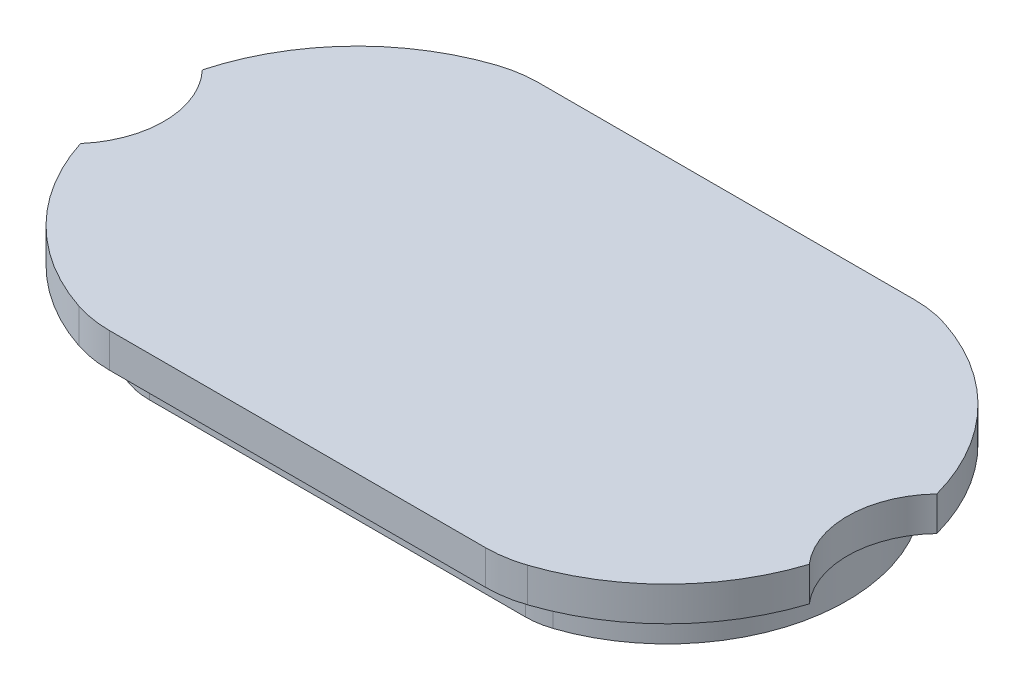
ISO-10303-21;
HEADER;
FILE_DESCRIPTION(('STEP AP214'),'2;1');
FILE_NAME('part.step','',(''),(''),'','','');
FILE_SCHEMA(('AUTOMOTIVE_DESIGN { 1 0 10303 214 1 1 1 1 }'));
ENDSEC;
DATA;
#1=APPLICATION_CONTEXT('core data for automotive mechanical design processes');
#2=APPLICATION_PROTOCOL_DEFINITION('international standard','automotive_design',2000,#1);
#3=PRODUCT_CONTEXT('',#1,'mechanical');
#4=PRODUCT('Part','Part','',(#3));
#5=PRODUCT_RELATED_PRODUCT_CATEGORY('part','',(#4));
#6=PRODUCT_DEFINITION_FORMATION('','',#4);
#7=PRODUCT_DEFINITION_CONTEXT('part definition',#1,'design');
#8=PRODUCT_DEFINITION('design','',#6,#7);
#9=PRODUCT_DEFINITION_SHAPE('','',#8);
#10=(LENGTH_UNIT() NAMED_UNIT(*) SI_UNIT(.MILLI.,.METRE.));
#11=(NAMED_UNIT(*) PLANE_ANGLE_UNIT() SI_UNIT($,.RADIAN.));
#12=(NAMED_UNIT(*) SI_UNIT($,.STERADIAN.) SOLID_ANGLE_UNIT());
#13=UNCERTAINTY_MEASURE_WITH_UNIT(LENGTH_MEASURE(1.E-05),#10,'distance_accuracy_value','');
#14=(GEOMETRIC_REPRESENTATION_CONTEXT(3) GLOBAL_UNCERTAINTY_ASSIGNED_CONTEXT((#13)) GLOBAL_UNIT_ASSIGNED_CONTEXT((#10,
#11,#12)) REPRESENTATION_CONTEXT('',''));
#15=CARTESIAN_POINT('',(0.,0.,0.));
#16=DIRECTION('',(0.,0.,1.));
#17=DIRECTION('',(1.,0.,0.));
#18=AXIS2_PLACEMENT_3D('',#15,#16,#17);
#19=CARTESIAN_POINT('',(-28.0219830583856,6.,-1.10913174767152));
#20=DIRECTION('',(0.,-1.,0.));
#21=DIRECTION('',(0.,0.,-1.));
#22=AXIS2_PLACEMENT_3D('',#19,#20,#21);
#23=CYLINDRICAL_SURFACE('',#22,38.4375);
#24=DIRECTION('',(0.,-1.,0.));
#25=VECTOR('',#24,1.);
#26=CARTESIAN_POINT('',(-65.1201453529565,5.,-11.1673503084143));
#27=LINE('',#26,#25);
#28=CARTESIAN_POINT('',(-65.1201453529565,6.,-11.1673503084143));
#29=VERTEX_POINT('',#28);
#30=CARTESIAN_POINT('',(-65.1201453529565,0.,-11.1673503084143));
#31=VERTEX_POINT('',#30);
#32=EDGE_CURVE('E218',#29,#31,#27,.T.);
#33=ORIENTED_EDGE('',*,*,#32,.F.);
#34=CARTESIAN_POINT('',(-28.0219830583856,6.,-1.10913174767152));
#35=DIRECTION('',(0.,1.,0.));
#36=DIRECTION('',(0.,0.,1.));
#37=AXIS2_PLACEMENT_3D('',#34,#35,#36);
#38=CIRCLE('',#37,38.4375);
#39=CARTESIAN_POINT('',(-40.1227436589354,6.,-37.5921825951292));
#40=VERTEX_POINT('',#39);
#41=EDGE_CURVE('E309',#40,#29,#38,.T.);
#42=ORIENTED_EDGE('',*,*,#41,.F.);
#43=DIRECTION('',(0.,-1.,0.));
#44=VECTOR('',#43,1.);
#45=CARTESIAN_POINT('',(-40.1227436589354,6.,-37.5921825951292));
#46=LINE('',#45,#44);
#47=CARTESIAN_POINT('',(-40.1227436589354,0.,-37.5921825951292));
#48=VERTEX_POINT('',#47);
#49=EDGE_CURVE('E259',#40,#48,#46,.T.);
#50=ORIENTED_EDGE('',*,*,#49,.T.);
#51=CARTESIAN_POINT('',(-28.0219830583856,0.,-1.10913174767152));
#52=DIRECTION('',(0.,1.,0.));
#53=DIRECTION('',(0.,0.,1.));
#54=AXIS2_PLACEMENT_3D('',#51,#52,#53);
#55=CIRCLE('',#54,38.4375);
#56=EDGE_CURVE('E237',#48,#31,#55,.T.);
#57=ORIENTED_EDGE('',*,*,#56,.T.);
#58=EDGE_LOOP('',(#33,#42,#50,#57));
#59=FACE_BOUND('',#58,.T.);
#60=ADVANCED_FACE('F33',(#59),#23,.T.);
#61=DIRECTION('',(0.,-1.,0.));
#62=VECTOR('',#61,1.);
#63=CARTESIAN_POINT('',(-64.6259224052166,5.,10.6208738168417));
#64=LINE('',#63,#62);
#65=CARTESIAN_POINT('',(-64.6259224052166,0.,10.6208738168417));
#66=VERTEX_POINT('',#65);
#67=CARTESIAN_POINT('',(-64.6259224052166,6.,10.6208738168417));
#68=VERTEX_POINT('',#67);
#69=EDGE_CURVE('E48',#66,#68,#64,.F.);
#70=ORIENTED_EDGE('',*,*,#69,.F.);
#71=CARTESIAN_POINT('',(-40.1227436589354,0.,35.3739190997861));
#72=VERTEX_POINT('',#71);
#73=EDGE_CURVE('E228',#66,#72,#55,.T.);
#74=ORIENTED_EDGE('',*,*,#73,.T.);
#75=DIRECTION('',(0.,-1.,0.));
#76=VECTOR('',#75,1.);
#77=CARTESIAN_POINT('',(-40.1227436589354,6.,35.3739190997861));
#78=LINE('',#77,#76);
#79=CARTESIAN_POINT('',(-40.1227436589354,6.,35.3739190997861));
#80=VERTEX_POINT('',#79);
#81=EDGE_CURVE('E257',#72,#80,#78,.F.);
#82=ORIENTED_EDGE('',*,*,#81,.T.);
#83=EDGE_CURVE('E230',#68,#80,#38,.T.);
#84=ORIENTED_EDGE('',*,*,#83,.F.);
#85=EDGE_LOOP('',(#70,#74,#82,#84));
#86=FACE_BOUND('',#85,.T.);
#87=ADVANCED_FACE('F226',(#86),#23,.T.);
#88=CARTESIAN_POINT('',(26.1030169416145,6.,-1.10913174767152));
#89=DIRECTION('',(0.,-1.,0.));
#90=DIRECTION('',(0.,0.,-1.));
#91=AXIS2_PLACEMENT_3D('',#88,#89,#90);
#92=CYLINDRICAL_SURFACE('',#91,38.4375);
#93=DIRECTION('',(0.,-1.,0.));
#94=VECTOR('',#93,1.);
#95=CARTESIAN_POINT('',(62.7069562884455,5.,10.6208738168417));
#96=LINE('',#95,#94);
#97=CARTESIAN_POINT('',(62.7069562884455,6.,10.6208738168417));
#98=VERTEX_POINT('',#97);
#99=CARTESIAN_POINT('',(62.7069562884455,0.,10.6208738168417));
#100=VERTEX_POINT('',#99);
#101=EDGE_CURVE('E506',#98,#100,#96,.T.);
#102=ORIENTED_EDGE('',*,*,#101,.F.);
#103=CARTESIAN_POINT('',(26.1030169416145,6.,-1.10913174767152));
#104=DIRECTION('',(0.,1.,0.));
#105=DIRECTION('',(0.,0.,-1.));
#106=AXIS2_PLACEMENT_3D('',#103,#104,#105);
#107=CIRCLE('',#106,38.4375);
#108=CARTESIAN_POINT('',(38.2037775421643,6.,35.3739190997861));
#109=VERTEX_POINT('',#108);
#110=EDGE_CURVE('E300',#109,#98,#107,.T.);
#111=ORIENTED_EDGE('',*,*,#110,.F.);
#112=DIRECTION('',(0.,-1.,0.));
#113=VECTOR('',#112,1.);
#114=CARTESIAN_POINT('',(38.2037775421643,6.,35.3739190997861));
#115=LINE('',#114,#113);
#116=CARTESIAN_POINT('',(38.2037775421643,0.,35.3739190997861));
#117=VERTEX_POINT('',#116);
#118=EDGE_CURVE('E291',#109,#117,#115,.T.);
#119=ORIENTED_EDGE('',*,*,#118,.T.);
#120=CARTESIAN_POINT('',(26.1030169416145,0.,-1.10913174767152));
#121=DIRECTION('',(0.,1.,0.));
#122=DIRECTION('',(0.,0.,-1.));
#123=AXIS2_PLACEMENT_3D('',#120,#121,#122);
#124=CIRCLE('',#123,38.4375);
#125=EDGE_CURVE('E251',#117,#100,#124,.T.);
#126=ORIENTED_EDGE('',*,*,#125,.T.);
#127=EDGE_LOOP('',(#102,#111,#119,#126));
#128=FACE_BOUND('',#127,.T.);
#129=ADVANCED_FACE('F631',(#128),#92,.T.);
#130=DIRECTION('',(0.,-1.,0.));
#131=VECTOR('',#130,1.);
#132=CARTESIAN_POINT('',(63.2011792361854,5.,-11.1673503084143));
#133=LINE('',#132,#131);
#134=CARTESIAN_POINT('',(63.2011792361854,0.,-11.1673503084143));
#135=VERTEX_POINT('',#134);
#136=CARTESIAN_POINT('',(63.2011792361854,6.,-11.1673503084143));
#137=VERTEX_POINT('',#136);
#138=EDGE_CURVE('E55',#135,#137,#133,.F.);
#139=ORIENTED_EDGE('',*,*,#138,.F.);
#140=CARTESIAN_POINT('',(38.2037775421643,0.,-37.5921825951292));
#141=VERTEX_POINT('',#140);
#142=EDGE_CURVE('E250',#135,#141,#124,.T.);
#143=ORIENTED_EDGE('',*,*,#142,.T.);
#144=DIRECTION('',(0.,-1.,0.));
#145=VECTOR('',#144,1.);
#146=CARTESIAN_POINT('',(38.2037775421643,6.,-37.5921825951292));
#147=LINE('',#146,#145);
#148=CARTESIAN_POINT('',(38.2037775421643,6.,-37.5921825951292));
#149=VERTEX_POINT('',#148);
#150=EDGE_CURVE('E288',#141,#149,#147,.F.);
#151=ORIENTED_EDGE('',*,*,#150,.T.);
#152=EDGE_CURVE('E298',#137,#149,#107,.T.);
#153=ORIENTED_EDGE('',*,*,#152,.F.);
#154=EDGE_LOOP('',(#139,#143,#151,#153));
#155=FACE_BOUND('',#154,.T.);
#156=ADVANCED_FACE('F303',(#155),#92,.T.);
#157=CARTESIAN_POINT('',(-28.0219830583856,0.,-1.10913174767152));
#158=DIRECTION('',(0.,1.,0.));
#159=DIRECTION('',(0.,0.,1.));
#160=AXIS2_PLACEMENT_3D('',#157,#158,#159);
#161=PLANE('',#160);
#162=CARTESIAN_POINT('',(-76.9189661167711,0.,0.));
#163=DIRECTION('',(0.,1.,0.));
#164=DIRECTION('',(0.,0.,-1.));
#165=AXIS2_PLACEMENT_3D('',#162,#163,#164);
#166=CIRCLE('',#165,16.2456727877753);
#167=EDGE_CURVE('E215',#66,#31,#166,.T.);
#168=ORIENTED_EDGE('',*,*,#167,.T.);
#169=ORIENTED_EDGE('',*,*,#56,.F.);
#170=CARTESIAN_POINT('',(-33.8264129399501,0.,-18.6091317476715));
#171=DIRECTION('',(0.,1.,0.));
#172=DIRECTION('',(0.,0.,1.));
#173=AXIS2_PLACEMENT_3D('',#170,#171,#172);
#174=CIRCLE('',#173,20.);
#175=CARTESIAN_POINT('',(-33.8264129399502,0.,-38.6091317476715));
#176=VERTEX_POINT('',#175);
#177=EDGE_CURVE('E268',#48,#176,#174,.F.);
#178=ORIENTED_EDGE('',*,*,#177,.T.);
#179=DIRECTION('',(-1.,0.,0.));
#180=VECTOR('',#179,1.);
#181=CARTESIAN_POINT('',(34.5405169416144,0.,-38.6091317476715));
#182=LINE('',#181,#180);
#183=CARTESIAN_POINT('',(31.907446823179,0.,-38.6091317476715));
#184=VERTEX_POINT('',#183);
#185=EDGE_CURVE('E254',#184,#176,#182,.T.);
#186=ORIENTED_EDGE('',*,*,#185,.F.);
#187=CARTESIAN_POINT('',(31.907446823179,0.,-18.6091317476715));
#188=DIRECTION('',(0.,1.,0.));
#189=DIRECTION('',(0.,0.,1.));
#190=AXIS2_PLACEMENT_3D('',#187,#188,#189);
#191=CIRCLE('',#190,20.);
#192=EDGE_CURVE('E262',#184,#141,#191,.F.);
#193=ORIENTED_EDGE('',*,*,#192,.T.);
#194=ORIENTED_EDGE('',*,*,#142,.F.);
#195=CARTESIAN_POINT('',(75.,0.,0.));
#196=DIRECTION('',(0.,1.,0.));
#197=DIRECTION('',(0.,0.,1.));
#198=AXIS2_PLACEMENT_3D('',#195,#196,#197);
#199=CIRCLE('',#198,16.2456727877753);
#200=EDGE_CURVE('E657',#135,#100,#199,.T.);
#201=ORIENTED_EDGE('',*,*,#200,.T.);
#202=ORIENTED_EDGE('',*,*,#125,.F.);
#203=CARTESIAN_POINT('',(31.907446823179,0.,16.3908682523285));
#204=DIRECTION('',(0.,1.,0.));
#205=DIRECTION('',(0.,0.,1.));
#206=AXIS2_PLACEMENT_3D('',#203,#204,#205);
#207=CIRCLE('',#206,20.);
#208=CARTESIAN_POINT('',(31.907446823179,0.,36.3908682523285));
#209=VERTEX_POINT('',#208);
#210=EDGE_CURVE('E265',#117,#209,#207,.F.);
#211=ORIENTED_EDGE('',*,*,#210,.T.);
#212=DIRECTION('',(1.,0.,0.));
#213=VECTOR('',#212,1.);
#214=CARTESIAN_POINT('',(34.5405169416144,0.,36.3908682523285));
#215=LINE('',#214,#213);
#216=CARTESIAN_POINT('',(-33.8264129399501,0.,36.3908682523285));
#217=VERTEX_POINT('',#216);
#218=EDGE_CURVE('E240',#217,#209,#215,.T.);
#219=ORIENTED_EDGE('',*,*,#218,.F.);
#220=CARTESIAN_POINT('',(-33.8264129399501,0.,16.3908682523285));
#221=DIRECTION('',(0.,1.,0.));
#222=DIRECTION('',(0.,0.,1.));
#223=AXIS2_PLACEMENT_3D('',#220,#221,#222);
#224=CIRCLE('',#223,20.);
#225=EDGE_CURVE('E235',#217,#72,#224,.F.);
#226=ORIENTED_EDGE('',*,*,#225,.T.);
#227=ORIENTED_EDGE('',*,*,#73,.F.);
#228=EDGE_LOOP('',(#168,#169,#178,#186,#193,#194,#201,#202,#211,#219,#226,#227));
#229=FACE_BOUND('',#228,.T.);
#230=CARTESIAN_POINT('',(31.907446823179,0.,-18.6091317476715));
#231=DIRECTION('',(0.,1.,0.));
#232=DIRECTION('',(0.,0.,1.));
#233=AXIS2_PLACEMENT_3D('',#230,#231,#232);
#234=CIRCLE('',#233,13.);
#235=CARTESIAN_POINT('',(36.0000617905195,0.,-30.948114798519));
#236=VERTEX_POINT('',#235);
#237=CARTESIAN_POINT('',(31.9074468231791,0.,-31.6091317476715));
#238=VERTEX_POINT('',#237);
#239=EDGE_CURVE('E396',#236,#238,#234,.T.);
#240=ORIENTED_EDGE('',*,*,#239,.T.);
#241=DIRECTION('',(1.,0.,0.));
#242=VECTOR('',#241,1.);
#243=CARTESIAN_POINT('',(-33.8264129399501,0.,-31.6091317476715));
#244=LINE('',#243,#242);
#245=CARTESIAN_POINT('',(-33.8264129399501,0.,-31.6091317476715));
#246=VERTEX_POINT('',#245);
#247=EDGE_CURVE('E319',#246,#238,#244,.T.);
#248=ORIENTED_EDGE('',*,*,#247,.F.);
#249=CARTESIAN_POINT('',(-33.8264129399501,0.,-18.6091317476715));
#250=DIRECTION('',(0.,1.,0.));
#251=DIRECTION('',(0.,0.,1.));
#252=AXIS2_PLACEMENT_3D('',#249,#250,#251);
#253=CIRCLE('',#252,13.);
#254=CARTESIAN_POINT('',(-37.9190279072906,0.,-30.948114798519));
#255=VERTEX_POINT('',#254);
#256=EDGE_CURVE('E515',#246,#255,#253,.T.);
#257=ORIENTED_EDGE('',*,*,#256,.T.);
#258=CARTESIAN_POINT('',(-28.0219830583856,0.,-1.10913174767152));
#259=DIRECTION('',(0.,1.,0.));
#260=DIRECTION('',(0.,0.,1.));
#261=AXIS2_PLACEMENT_3D('',#258,#259,#260);
#262=CIRCLE('',#261,31.4375);
#263=CARTESIAN_POINT('',(-37.9190279072906,0.,28.7298513031759));
#264=VERTEX_POINT('',#263);
#265=EDGE_CURVE('E533',#255,#264,#262,.T.);
#266=ORIENTED_EDGE('',*,*,#265,.T.);
#267=CARTESIAN_POINT('',(-33.8264129399501,0.,16.3908682523285));
#268=DIRECTION('',(0.,1.,0.));
#269=DIRECTION('',(0.,0.,1.));
#270=AXIS2_PLACEMENT_3D('',#267,#268,#269);
#271=CIRCLE('',#270,13.);
#272=CARTESIAN_POINT('',(-33.8264129399502,0.,29.3908682523285));
#273=VERTEX_POINT('',#272);
#274=EDGE_CURVE('E554',#264,#273,#271,.T.);
#275=ORIENTED_EDGE('',*,*,#274,.T.);
#276=DIRECTION('',(1.,0.,0.));
#277=VECTOR('',#276,1.);
#278=CARTESIAN_POINT('',(-33.8264129399502,0.,29.3908682523285));
#279=LINE('',#278,#277);
#280=CARTESIAN_POINT('',(31.907446823179,0.,29.3908682523285));
#281=VERTEX_POINT('',#280);
#282=EDGE_CURVE('E575',#273,#281,#279,.T.);
#283=ORIENTED_EDGE('',*,*,#282,.T.);
#284=CARTESIAN_POINT('',(31.907446823179,0.,16.3908682523285));
#285=DIRECTION('',(0.,1.,0.));
#286=DIRECTION('',(0.,0.,1.));
#287=AXIS2_PLACEMENT_3D('',#284,#285,#286);
#288=CIRCLE('',#287,13.);
#289=CARTESIAN_POINT('',(36.0000617905195,0.,28.7298513031759));
#290=VERTEX_POINT('',#289);
#291=EDGE_CURVE('E593',#281,#290,#288,.T.);
#292=ORIENTED_EDGE('',*,*,#291,.T.);
#293=CARTESIAN_POINT('',(26.1030169416145,0.,-1.10913174767152));
#294=DIRECTION('',(0.,1.,0.));
#295=DIRECTION('',(0.,0.,1.));
#296=AXIS2_PLACEMENT_3D('',#293,#294,#295);
#297=CIRCLE('',#296,31.4375);
#298=EDGE_CURVE('E475',#290,#236,#297,.T.);
#299=ORIENTED_EDGE('',*,*,#298,.T.);
#300=EDGE_LOOP('',(#240,#248,#257,#266,#275,#283,#292,#299));
#301=FACE_BOUND('',#300,.T.);
#302=ADVANCED_FACE('F232',(#229,#301),#161,.F.);
#303=CARTESIAN_POINT('',(34.5405169416144,6.,36.3908682523285));
#304=DIRECTION('',(0.,0.,-1.));
#305=DIRECTION('',(-1.,0.,0.));
#306=AXIS2_PLACEMENT_3D('',#303,#304,#305);
#307=PLANE('',#306);
#308=DIRECTION('',(1.,0.,0.));
#309=VECTOR('',#308,1.);
#310=CARTESIAN_POINT('',(34.5405169416144,6.,36.3908682523285));
#311=LINE('',#310,#309);
#312=CARTESIAN_POINT('',(-33.8264129399501,6.,36.3908682523285));
#313=VERTEX_POINT('',#312);
#314=CARTESIAN_POINT('',(31.907446823179,6.,36.3908682523285));
#315=VERTEX_POINT('',#314);
#316=EDGE_CURVE('E307',#313,#315,#311,.T.);
#317=ORIENTED_EDGE('',*,*,#316,.F.);
#318=DIRECTION('',(0.,-1.,0.));
#319=VECTOR('',#318,1.);
#320=CARTESIAN_POINT('',(-33.8264129399501,6.,36.3908682523285));
#321=LINE('',#320,#319);
#322=EDGE_CURVE('E285',#313,#217,#321,.T.);
#323=ORIENTED_EDGE('',*,*,#322,.T.);
#324=ORIENTED_EDGE('',*,*,#218,.T.);
#325=DIRECTION('',(0.,-1.,0.));
#326=VECTOR('',#325,1.);
#327=CARTESIAN_POINT('',(31.907446823179,6.,36.3908682523285));
#328=LINE('',#327,#326);
#329=EDGE_CURVE('E283',#209,#315,#328,.F.);
#330=ORIENTED_EDGE('',*,*,#329,.T.);
#331=EDGE_LOOP('',(#317,#323,#324,#330));
#332=FACE_BOUND('',#331,.T.);
#333=ADVANCED_FACE('F634',(#332),#307,.F.);
#334=CARTESIAN_POINT('',(34.5405169416144,6.,-38.6091317476715));
#335=DIRECTION('',(0.,0.,1.));
#336=DIRECTION('',(1.,0.,0.));
#337=AXIS2_PLACEMENT_3D('',#334,#335,#336);
#338=PLANE('',#337);
#339=ORIENTED_EDGE('',*,*,#185,.T.);
#340=DIRECTION('',(0.,-1.,0.));
#341=VECTOR('',#340,1.);
#342=CARTESIAN_POINT('',(-33.8264129399502,6.,-38.6091317476715));
#343=LINE('',#342,#341);
#344=CARTESIAN_POINT('',(-33.8264129399502,6.,-38.6091317476715));
#345=VERTEX_POINT('',#344);
#346=EDGE_CURVE('E273',#176,#345,#343,.F.);
#347=ORIENTED_EDGE('',*,*,#346,.T.);
#348=DIRECTION('',(-1.,0.,0.));
#349=VECTOR('',#348,1.);
#350=CARTESIAN_POINT('',(34.5405169416144,6.,-38.6091317476715));
#351=LINE('',#350,#349);
#352=CARTESIAN_POINT('',(31.907446823179,6.,-38.6091317476715));
#353=VERTEX_POINT('',#352);
#354=EDGE_CURVE('E246',#353,#345,#351,.T.);
#355=ORIENTED_EDGE('',*,*,#354,.F.);
#356=DIRECTION('',(0.,-1.,0.));
#357=VECTOR('',#356,1.);
#358=CARTESIAN_POINT('',(31.907446823179,6.,-38.6091317476715));
#359=LINE('',#358,#357);
#360=EDGE_CURVE('E270',#353,#184,#359,.T.);
#361=ORIENTED_EDGE('',*,*,#360,.T.);
#362=EDGE_LOOP('',(#339,#347,#355,#361));
#363=FACE_BOUND('',#362,.T.);
#364=ADVANCED_FACE('F676',(#363),#338,.F.);
#365=CARTESIAN_POINT('',(-28.0219830583856,6.,-1.10913174767152));
#366=DIRECTION('',(0.,1.,0.));
#367=DIRECTION('',(0.,0.,1.));
#368=AXIS2_PLACEMENT_3D('',#365,#366,#367);
#369=PLANE('',#368);
#370=ORIENTED_EDGE('',*,*,#41,.T.);
#371=CARTESIAN_POINT('',(-76.9189661167711,6.,0.));
#372=DIRECTION('',(0.,1.,0.));
#373=DIRECTION('',(0.,0.,1.));
#374=AXIS2_PLACEMENT_3D('',#371,#372,#373);
#375=CIRCLE('',#374,16.2456727877753);
#376=EDGE_CURVE('E11',#29,#68,#375,.F.);
#377=ORIENTED_EDGE('',*,*,#376,.T.);
#378=ORIENTED_EDGE('',*,*,#83,.T.);
#379=CARTESIAN_POINT('',(-33.8264129399501,6.,16.3908682523285));
#380=DIRECTION('',(0.,1.,0.));
#381=DIRECTION('',(0.,0.,1.));
#382=AXIS2_PLACEMENT_3D('',#379,#380,#381);
#383=CIRCLE('',#382,20.);
#384=EDGE_CURVE('E279',#80,#313,#383,.T.);
#385=ORIENTED_EDGE('',*,*,#384,.T.);
#386=ORIENTED_EDGE('',*,*,#316,.T.);
#387=CARTESIAN_POINT('',(31.907446823179,6.,16.3908682523285));
#388=DIRECTION('',(0.,1.,0.));
#389=DIRECTION('',(0.,0.,1.));
#390=AXIS2_PLACEMENT_3D('',#387,#388,#389);
#391=CIRCLE('',#390,20.);
#392=EDGE_CURVE('E277',#315,#109,#391,.T.);
#393=ORIENTED_EDGE('',*,*,#392,.T.);
#394=ORIENTED_EDGE('',*,*,#110,.T.);
#395=CARTESIAN_POINT('',(75.,6.,0.));
#396=DIRECTION('',(0.,1.,0.));
#397=DIRECTION('',(0.,0.,1.));
#398=AXIS2_PLACEMENT_3D('',#395,#396,#397);
#399=CIRCLE('',#398,16.2456727877753);
#400=EDGE_CURVE('E41',#98,#137,#399,.F.);
#401=ORIENTED_EDGE('',*,*,#400,.T.);
#402=ORIENTED_EDGE('',*,*,#152,.T.);
#403=CARTESIAN_POINT('',(31.907446823179,6.,-18.6091317476715));
#404=DIRECTION('',(0.,1.,0.));
#405=DIRECTION('',(0.,0.,1.));
#406=AXIS2_PLACEMENT_3D('',#403,#404,#405);
#407=CIRCLE('',#406,20.);
#408=EDGE_CURVE('E275',#149,#353,#407,.T.);
#409=ORIENTED_EDGE('',*,*,#408,.T.);
#410=ORIENTED_EDGE('',*,*,#354,.T.);
#411=CARTESIAN_POINT('',(-33.8264129399501,6.,-18.6091317476715));
#412=DIRECTION('',(0.,1.,0.));
#413=DIRECTION('',(0.,0.,1.));
#414=AXIS2_PLACEMENT_3D('',#411,#412,#413);
#415=CIRCLE('',#414,20.);
#416=EDGE_CURVE('E281',#345,#40,#415,.T.);
#417=ORIENTED_EDGE('',*,*,#416,.T.);
#418=EDGE_LOOP('',(#370,#377,#378,#385,#386,#393,#394,#401,#402,#409,#410,#417));
#419=FACE_BOUND('',#418,.T.);
#420=ADVANCED_FACE('F297',(#419),#369,.T.);
#421=CARTESIAN_POINT('',(-33.8264129399501,6.,-18.6091317476715));
#422=DIRECTION('',(0.,-1.,0.));
#423=DIRECTION('',(0.,0.,-1.));
#424=AXIS2_PLACEMENT_3D('',#421,#422,#423);
#425=CYLINDRICAL_SURFACE('',#424,20.);
#426=ORIENTED_EDGE('',*,*,#416,.F.);
#427=ORIENTED_EDGE('',*,*,#346,.F.);
#428=ORIENTED_EDGE('',*,*,#177,.F.);
#429=ORIENTED_EDGE('',*,*,#49,.F.);
#430=EDGE_LOOP('',(#426,#427,#428,#429));
#431=FACE_BOUND('',#430,.T.);
#432=ADVANCED_FACE('F636',(#431),#425,.T.);
#433=CARTESIAN_POINT('',(-33.8264129399501,6.,16.3908682523285));
#434=DIRECTION('',(0.,-1.,0.));
#435=DIRECTION('',(0.,0.,-1.));
#436=AXIS2_PLACEMENT_3D('',#433,#434,#435);
#437=CYLINDRICAL_SURFACE('',#436,20.);
#438=ORIENTED_EDGE('',*,*,#384,.F.);
#439=ORIENTED_EDGE('',*,*,#81,.F.);
#440=ORIENTED_EDGE('',*,*,#225,.F.);
#441=ORIENTED_EDGE('',*,*,#322,.F.);
#442=EDGE_LOOP('',(#438,#439,#440,#441));
#443=FACE_BOUND('',#442,.T.);
#444=ADVANCED_FACE('F639',(#443),#437,.T.);
#445=CARTESIAN_POINT('',(31.907446823179,6.,16.3908682523285));
#446=DIRECTION('',(0.,-1.,0.));
#447=DIRECTION('',(0.,0.,-1.));
#448=AXIS2_PLACEMENT_3D('',#445,#446,#447);
#449=CYLINDRICAL_SURFACE('',#448,20.);
#450=ORIENTED_EDGE('',*,*,#392,.F.);
#451=ORIENTED_EDGE('',*,*,#329,.F.);
#452=ORIENTED_EDGE('',*,*,#210,.F.);
#453=ORIENTED_EDGE('',*,*,#118,.F.);
#454=EDGE_LOOP('',(#450,#451,#452,#453));
#455=FACE_BOUND('',#454,.T.);
#456=ADVANCED_FACE('F642',(#455),#449,.T.);
#457=CARTESIAN_POINT('',(31.907446823179,6.,-18.6091317476715));
#458=DIRECTION('',(0.,-1.,0.));
#459=DIRECTION('',(0.,0.,-1.));
#460=AXIS2_PLACEMENT_3D('',#457,#458,#459);
#461=CYLINDRICAL_SURFACE('',#460,20.);
#462=ORIENTED_EDGE('',*,*,#408,.F.);
#463=ORIENTED_EDGE('',*,*,#150,.F.);
#464=ORIENTED_EDGE('',*,*,#192,.F.);
#465=ORIENTED_EDGE('',*,*,#360,.F.);
#466=EDGE_LOOP('',(#462,#463,#464,#465));
#467=FACE_BOUND('',#466,.T.);
#468=ADVANCED_FACE('F35',(#467),#461,.T.);
#469=CARTESIAN_POINT('',(36.0000617905195,-8.,-30.948114798519));
#470=DIRECTION('',(0.,1.,0.));
#471=DIRECTION('',(0.,0.,1.));
#472=AXIS2_PLACEMENT_3D('',#469,#470,#471);
#473=PLANE('',#472);
#474=DIRECTION('',(0.314816535949266,0.,-0.949152542372881));
#475=VECTOR('',#474,1.);
#476=CARTESIAN_POINT('',(36.0000617905195,-8.,-30.948114798519));
#477=LINE('',#476,#475);
#478=CARTESIAN_POINT('',(35.0556121826717,-8.,-28.1006571714003));
#479=VERTEX_POINT('',#478);
#480=CARTESIAN_POINT('',(36.0000617905195,-8.,-30.948114798519));
#481=VERTEX_POINT('',#480);
#482=EDGE_CURVE('E437',#479,#481,#477,.T.);
#483=ORIENTED_EDGE('',*,*,#482,.F.);
#484=CARTESIAN_POINT('',(31.907446823179,-8.,-18.6091317476715));
#485=DIRECTION('',(0.,1.,0.));
#486=DIRECTION('',(0.,0.,1.));
#487=AXIS2_PLACEMENT_3D('',#484,#485,#486);
#488=CIRCLE('',#487,10.);
#489=CARTESIAN_POINT('',(31.907446823179,-8.,-28.6091317476715));
#490=VERTEX_POINT('',#489);
#491=EDGE_CURVE('E242',#479,#490,#488,.T.);
#492=ORIENTED_EDGE('',*,*,#491,.T.);
#493=CARTESIAN_POINT('',(31.9074468231791,-8.,-28.6091317476715));
#494=DIRECTION('',(0.,0.,-1.));
#495=VECTOR('',#494,1.);
#496=LINE('',#493,#495);
#497=CARTESIAN_POINT('',(31.9074468231791,-8.,-31.6091317476715));
#498=VERTEX_POINT('',#497);
#499=EDGE_CURVE('E370',#490,#498,#496,.T.);
#500=ORIENTED_EDGE('',*,*,#499,.T.);
#501=CARTESIAN_POINT('',(31.907446823179,-8.,-18.6091317476715));
#502=DIRECTION('',(0.,1.,0.));
#503=DIRECTION('',(0.,0.,1.));
#504=AXIS2_PLACEMENT_3D('',#501,#502,#503);
#505=CIRCLE('',#504,13.);
#506=EDGE_CURVE('E238',#481,#498,#505,.T.);
#507=ORIENTED_EDGE('',*,*,#506,.F.);
#508=EDGE_LOOP('',(#483,#492,#500,#507));
#509=FACE_BOUND('',#508,.T.);
#510=ADVANCED_FACE('F413',(#509),#473,.F.);
#511=CARTESIAN_POINT('',(31.907446823179,0.,-18.6091317476715));
#512=DIRECTION('',(0.,1.,0.));
#513=DIRECTION('',(0.,0.,1.));
#514=AXIS2_PLACEMENT_3D('',#511,#512,#513);
#515=CYLINDRICAL_SURFACE('',#514,10.);
#516=DIRECTION('',(0.,-1.,0.));
#517=VECTOR('',#516,1.);
#518=CARTESIAN_POINT('',(35.0556121826717,0.,-28.1006571714003));
#519=LINE('',#518,#517);
#520=CARTESIAN_POINT('',(35.0556121826717,0.,-28.1006571714003));
#521=VERTEX_POINT('',#520);
#522=EDGE_CURVE('E439',#521,#479,#519,.T.);
#523=ORIENTED_EDGE('',*,*,#522,.F.);
#524=CARTESIAN_POINT('',(31.907446823179,0.,-18.6091317476715));
#525=DIRECTION('',(0.,1.,0.));
#526=DIRECTION('',(0.,0.,1.));
#527=AXIS2_PLACEMENT_3D('',#524,#525,#526);
#528=CIRCLE('',#527,10.);
#529=CARTESIAN_POINT('',(31.907446823179,0.,-28.6091317476715));
#530=VERTEX_POINT('',#529);
#531=EDGE_CURVE('E394',#521,#530,#528,.T.);
#532=ORIENTED_EDGE('',*,*,#531,.T.);
#533=CARTESIAN_POINT('',(31.907446823179,0.,-28.6091317476715));
#534=DIRECTION('',(0.,-1.,0.));
#535=VECTOR('',#534,1.);
#536=LINE('',#533,#535);
#537=EDGE_CURVE('E441',#530,#490,#536,.T.);
#538=ORIENTED_EDGE('',*,*,#537,.T.);
#539=ORIENTED_EDGE('',*,*,#491,.F.);
#540=EDGE_LOOP('',(#523,#532,#538,#539));
#541=FACE_BOUND('',#540,.T.);
#542=ADVANCED_FACE('F402',(#541),#515,.F.);
#543=CARTESIAN_POINT('',(31.907446823179,0.,-18.6091317476715));
#544=DIRECTION('',(0.,1.,0.));
#545=DIRECTION('',(0.,0.,1.));
#546=AXIS2_PLACEMENT_3D('',#543,#544,#545);
#547=CYLINDRICAL_SURFACE('',#546,13.);
#548=DIRECTION('',(0.,1.,0.));
#549=VECTOR('',#548,1.);
#550=CARTESIAN_POINT('',(36.0000617905195,0.,-30.948114798519));
#551=LINE('',#550,#549);
#552=EDGE_CURVE('E477',#481,#236,#551,.T.);
#553=ORIENTED_EDGE('',*,*,#552,.F.);
#554=ORIENTED_EDGE('',*,*,#506,.T.);
#555=CARTESIAN_POINT('',(31.9074468231791,-8.,-31.6091317476715));
#556=DIRECTION('',(0.,1.,0.));
#557=VECTOR('',#556,1.);
#558=LINE('',#555,#557);
#559=EDGE_CURVE('E444',#498,#238,#558,.T.);
#560=ORIENTED_EDGE('',*,*,#559,.T.);
#561=ORIENTED_EDGE('',*,*,#239,.F.);
#562=EDGE_LOOP('',(#553,#554,#560,#561));
#563=FACE_BOUND('',#562,.T.);
#564=ADVANCED_FACE('F412',(#563),#547,.T.);
#565=CARTESIAN_POINT('',(36.0000617905195,-8.,28.7298513031759));
#566=DIRECTION('',(0.,1.,0.));
#567=DIRECTION('',(0.,0.,1.));
#568=AXIS2_PLACEMENT_3D('',#565,#566,#567);
#569=PLANE('',#568);
#570=DIRECTION('',(0.314816535949265,0.,0.949152542372882));
#571=VECTOR('',#570,1.);
#572=CARTESIAN_POINT('',(36.0000617905195,-8.,28.7298513031759));
#573=LINE('',#572,#571);
#574=CARTESIAN_POINT('',(35.0556121826717,-8.,25.8823936760573));
#575=VERTEX_POINT('',#574);
#576=CARTESIAN_POINT('',(36.0000617905195,-8.,28.7298513031759));
#577=VERTEX_POINT('',#576);
#578=EDGE_CURVE('E590',#575,#577,#573,.T.);
#579=ORIENTED_EDGE('',*,*,#578,.F.);
#580=CARTESIAN_POINT('',(26.1030169416145,-8.,-1.10913174767152));
#581=DIRECTION('',(0.,1.,0.));
#582=DIRECTION('',(0.,0.,1.));
#583=AXIS2_PLACEMENT_3D('',#580,#581,#582);
#584=CIRCLE('',#583,28.4375);
#585=EDGE_CURVE('E449',#575,#479,#584,.T.);
#586=ORIENTED_EDGE('',*,*,#585,.T.);
#587=ORIENTED_EDGE('',*,*,#482,.T.);
#588=CARTESIAN_POINT('',(26.1030169416145,-8.,-1.10913174767152));
#589=DIRECTION('',(0.,1.,0.));
#590=DIRECTION('',(0.,0.,1.));
#591=AXIS2_PLACEMENT_3D('',#588,#589,#590);
#592=CIRCLE('',#591,31.4375);
#593=EDGE_CURVE('E445',#577,#481,#592,.T.);
#594=ORIENTED_EDGE('',*,*,#593,.F.);
#595=EDGE_LOOP('',(#579,#586,#587,#594));
#596=FACE_BOUND('',#595,.T.);
#597=ADVANCED_FACE('F739',(#596),#569,.F.);
#598=CARTESIAN_POINT('',(26.1030169416145,0.,-1.10913174767152));
#599=DIRECTION('',(0.,1.,0.));
#600=DIRECTION('',(0.,0.,1.));
#601=AXIS2_PLACEMENT_3D('',#598,#599,#600);
#602=CYLINDRICAL_SURFACE('',#601,28.4375);
#603=DIRECTION('',(0.,-1.,0.));
#604=VECTOR('',#603,1.);
#605=CARTESIAN_POINT('',(35.0556121826717,0.,25.8823936760573));
#606=LINE('',#605,#604);
#607=CARTESIAN_POINT('',(35.0556121826717,0.,25.8823936760573));
#608=VERTEX_POINT('',#607);
#609=EDGE_CURVE('E493',#608,#575,#606,.T.);
#610=ORIENTED_EDGE('',*,*,#609,.F.);
#611=CARTESIAN_POINT('',(26.1030169416145,0.,-1.10913174767152));
#612=DIRECTION('',(0.,1.,0.));
#613=DIRECTION('',(0.,0.,1.));
#614=AXIS2_PLACEMENT_3D('',#611,#612,#613);
#615=CIRCLE('',#614,28.4375);
#616=EDGE_CURVE('E455',#608,#521,#615,.T.);
#617=ORIENTED_EDGE('',*,*,#616,.T.);
#618=ORIENTED_EDGE('',*,*,#522,.T.);
#619=ORIENTED_EDGE('',*,*,#585,.F.);
#620=EDGE_LOOP('',(#610,#617,#618,#619));
#621=FACE_BOUND('',#620,.T.);
#622=ADVANCED_FACE('F491',(#621),#602,.F.);
#623=CARTESIAN_POINT('',(26.1030169416145,0.,-1.10913174767152));
#624=DIRECTION('',(0.,1.,0.));
#625=DIRECTION('',(0.,0.,1.));
#626=AXIS2_PLACEMENT_3D('',#623,#624,#625);
#627=CYLINDRICAL_SURFACE('',#626,31.4375);
#628=DIRECTION('',(0.,1.,0.));
#629=VECTOR('',#628,1.);
#630=CARTESIAN_POINT('',(36.0000617905195,0.,28.7298513031759));
#631=LINE('',#630,#629);
#632=EDGE_CURVE('E587',#577,#290,#631,.T.);
#633=ORIENTED_EDGE('',*,*,#632,.F.);
#634=ORIENTED_EDGE('',*,*,#593,.T.);
#635=ORIENTED_EDGE('',*,*,#552,.T.);
#636=ORIENTED_EDGE('',*,*,#298,.F.);
#637=EDGE_LOOP('',(#633,#634,#635,#636));
#638=FACE_BOUND('',#637,.T.);
#639=ADVANCED_FACE('F478',(#638),#627,.T.);
#640=CARTESIAN_POINT('',(31.907446823179,-8.,29.3908682523285));
#641=DIRECTION('',(0.,1.,0.));
#642=DIRECTION('',(0.,0.,1.));
#643=AXIS2_PLACEMENT_3D('',#640,#641,#642);
#644=PLANE('',#643);
#645=DIRECTION('',(0.,0.,1.));
#646=VECTOR('',#645,1.);
#647=CARTESIAN_POINT('',(31.907446823179,-8.,29.3908682523285));
#648=LINE('',#647,#646);
#649=CARTESIAN_POINT('',(31.907446823179,-8.,26.3908682523285));
#650=VERTEX_POINT('',#649);
#651=CARTESIAN_POINT('',(31.907446823179,-8.,29.3908682523285));
#652=VERTEX_POINT('',#651);
#653=EDGE_CURVE('E572',#650,#652,#648,.T.);
#654=ORIENTED_EDGE('',*,*,#653,.F.);
#655=CARTESIAN_POINT('',(31.907446823179,-8.,16.3908682523285));
#656=DIRECTION('',(0.,1.,0.));
#657=DIRECTION('',(0.,0.,1.));
#658=AXIS2_PLACEMENT_3D('',#655,#656,#657);
#659=CIRCLE('',#658,10.);
#660=EDGE_CURVE('E484',#650,#575,#659,.T.);
#661=ORIENTED_EDGE('',*,*,#660,.T.);
#662=ORIENTED_EDGE('',*,*,#578,.T.);
#663=CARTESIAN_POINT('',(31.907446823179,-8.,16.3908682523285));
#664=DIRECTION('',(0.,1.,0.));
#665=DIRECTION('',(0.,0.,1.));
#666=AXIS2_PLACEMENT_3D('',#663,#664,#665);
#667=CIRCLE('',#666,13.);
#668=EDGE_CURVE('E480',#652,#577,#667,.T.);
#669=ORIENTED_EDGE('',*,*,#668,.F.);
#670=EDGE_LOOP('',(#654,#661,#662,#669));
#671=FACE_BOUND('',#670,.T.);
#672=ADVANCED_FACE('F599',(#671),#644,.F.);
#673=CARTESIAN_POINT('',(31.907446823179,0.,16.3908682523285));
#674=DIRECTION('',(0.,1.,0.));
#675=DIRECTION('',(0.,0.,1.));
#676=AXIS2_PLACEMENT_3D('',#673,#674,#675);
#677=CYLINDRICAL_SURFACE('',#676,10.);
#678=DIRECTION('',(0.,-1.,0.));
#679=VECTOR('',#678,1.);
#680=CARTESIAN_POINT('',(31.907446823179,0.,26.3908682523285));
#681=LINE('',#680,#679);
#682=CARTESIAN_POINT('',(31.907446823179,0.,26.3908682523285));
#683=VERTEX_POINT('',#682);
#684=EDGE_CURVE('E569',#683,#650,#681,.T.);
#685=ORIENTED_EDGE('',*,*,#684,.F.);
#686=CARTESIAN_POINT('',(31.907446823179,0.,16.3908682523285));
#687=DIRECTION('',(0.,1.,0.));
#688=DIRECTION('',(0.,0.,1.));
#689=AXIS2_PLACEMENT_3D('',#686,#687,#688);
#690=CIRCLE('',#689,10.);
#691=EDGE_CURVE('E595',#683,#608,#690,.T.);
#692=ORIENTED_EDGE('',*,*,#691,.T.);
#693=ORIENTED_EDGE('',*,*,#609,.T.);
#694=ORIENTED_EDGE('',*,*,#660,.F.);
#695=EDGE_LOOP('',(#685,#692,#693,#694));
#696=FACE_BOUND('',#695,.T.);
#697=ADVANCED_FACE('F602',(#696),#677,.F.);
#698=CARTESIAN_POINT('',(31.907446823179,0.,16.3908682523285));
#699=DIRECTION('',(0.,1.,0.));
#700=DIRECTION('',(0.,0.,1.));
#701=AXIS2_PLACEMENT_3D('',#698,#699,#700);
#702=CYLINDRICAL_SURFACE('',#701,13.);
#703=DIRECTION('',(0.,1.,0.));
#704=VECTOR('',#703,1.);
#705=CARTESIAN_POINT('',(31.907446823179,0.,29.3908682523285));
#706=LINE('',#705,#704);
#707=EDGE_CURVE('E566',#652,#281,#706,.T.);
#708=ORIENTED_EDGE('',*,*,#707,.F.);
#709=ORIENTED_EDGE('',*,*,#668,.T.);
#710=ORIENTED_EDGE('',*,*,#632,.T.);
#711=ORIENTED_EDGE('',*,*,#291,.F.);
#712=EDGE_LOOP('',(#708,#709,#710,#711));
#713=FACE_BOUND('',#712,.T.);
#714=ADVANCED_FACE('F779',(#713),#702,.T.);
#715=CARTESIAN_POINT('',(-33.8264129399502,-8.,29.3908682523285));
#716=DIRECTION('',(0.,1.,0.));
#717=DIRECTION('',(0.,0.,1.));
#718=AXIS2_PLACEMENT_3D('',#715,#716,#717);
#719=PLANE('',#718);
#720=DIRECTION('',(0.,0.,1.));
#721=VECTOR('',#720,1.);
#722=CARTESIAN_POINT('',(-33.8264129399502,-8.,29.3908682523285));
#723=LINE('',#722,#721);
#724=CARTESIAN_POINT('',(-33.8264129399501,-8.,26.3908682523285));
#725=VERTEX_POINT('',#724);
#726=CARTESIAN_POINT('',(-33.8264129399502,-8.,29.3908682523285));
#727=VERTEX_POINT('',#726);
#728=EDGE_CURVE('E551',#725,#727,#723,.T.);
#729=ORIENTED_EDGE('',*,*,#728,.F.);
#730=DIRECTION('',(1.,0.,0.));
#731=VECTOR('',#730,1.);
#732=CARTESIAN_POINT('',(-33.8264129399501,-8.,26.3908682523285));
#733=LINE('',#732,#731);
#734=EDGE_CURVE('E581',#725,#650,#733,.T.);
#735=ORIENTED_EDGE('',*,*,#734,.T.);
#736=ORIENTED_EDGE('',*,*,#653,.T.);
#737=DIRECTION('',(1.,0.,0.));
#738=VECTOR('',#737,1.);
#739=CARTESIAN_POINT('',(-33.8264129399502,-8.,29.3908682523285));
#740=LINE('',#739,#738);
#741=EDGE_CURVE('E584',#727,#652,#740,.T.);
#742=ORIENTED_EDGE('',*,*,#741,.F.);
#743=EDGE_LOOP('',(#729,#735,#736,#742));
#744=FACE_BOUND('',#743,.T.);
#745=ADVANCED_FACE('F788',(#744),#719,.F.);
#746=CARTESIAN_POINT('',(-33.8264129399501,0.,26.3908682523285));
#747=DIRECTION('',(0.,0.,1.));
#748=DIRECTION('',(1.,0.,0.));
#749=AXIS2_PLACEMENT_3D('',#746,#747,#748);
#750=PLANE('',#749);
#751=DIRECTION('',(0.,-1.,0.));
#752=VECTOR('',#751,1.);
#753=CARTESIAN_POINT('',(-33.8264129399501,0.,26.3908682523285));
#754=LINE('',#753,#752);
#755=CARTESIAN_POINT('',(-33.8264129399501,0.,26.3908682523285));
#756=VERTEX_POINT('',#755);
#757=EDGE_CURVE('E548',#756,#725,#754,.T.);
#758=ORIENTED_EDGE('',*,*,#757,.F.);
#759=DIRECTION('',(1.,0.,0.));
#760=VECTOR('',#759,1.);
#761=CARTESIAN_POINT('',(-33.8264129399501,0.,26.3908682523285));
#762=LINE('',#761,#760);
#763=EDGE_CURVE('E578',#756,#683,#762,.T.);
#764=ORIENTED_EDGE('',*,*,#763,.T.);
#765=ORIENTED_EDGE('',*,*,#684,.T.);
#766=ORIENTED_EDGE('',*,*,#734,.F.);
#767=EDGE_LOOP('',(#758,#764,#765,#766));
#768=FACE_BOUND('',#767,.T.);
#769=ADVANCED_FACE('F606',(#768),#750,.F.);
#770=CARTESIAN_POINT('',(-33.8264129399502,0.,29.3908682523285));
#771=DIRECTION('',(0.,0.,-1.));
#772=DIRECTION('',(-1.,0.,0.));
#773=AXIS2_PLACEMENT_3D('',#770,#771,#772);
#774=PLANE('',#773);
#775=DIRECTION('',(0.,1.,0.));
#776=VECTOR('',#775,1.);
#777=CARTESIAN_POINT('',(-33.8264129399502,0.,29.3908682523285));
#778=LINE('',#777,#776);
#779=EDGE_CURVE('E545',#727,#273,#778,.T.);
#780=ORIENTED_EDGE('',*,*,#779,.F.);
#781=ORIENTED_EDGE('',*,*,#741,.T.);
#782=ORIENTED_EDGE('',*,*,#707,.T.);
#783=ORIENTED_EDGE('',*,*,#282,.F.);
#784=EDGE_LOOP('',(#780,#781,#782,#783));
#785=FACE_BOUND('',#784,.T.);
#786=ADVANCED_FACE('F807',(#785),#774,.F.);
#787=CARTESIAN_POINT('',(-37.9190279072906,-8.,28.7298513031759));
#788=DIRECTION('',(0.,1.,0.));
#789=DIRECTION('',(0.,0.,1.));
#790=AXIS2_PLACEMENT_3D('',#787,#788,#789);
#791=PLANE('',#790);
#792=DIRECTION('',(-0.314816535949265,0.,0.949152542372882));
#793=VECTOR('',#792,1.);
#794=CARTESIAN_POINT('',(-37.9190279072906,-8.,28.7298513031759));
#795=LINE('',#794,#793);
#796=CARTESIAN_POINT('',(-36.9745782994428,-8.,25.8823936760573));
#797=VERTEX_POINT('',#796);
#798=CARTESIAN_POINT('',(-37.9190279072906,-8.,28.7298513031759));
#799=VERTEX_POINT('',#798);
#800=EDGE_CURVE('E530',#797,#799,#795,.T.);
#801=ORIENTED_EDGE('',*,*,#800,.F.);
#802=CARTESIAN_POINT('',(-33.8264129399501,-8.,16.3908682523285));
#803=DIRECTION('',(0.,1.,0.));
#804=DIRECTION('',(0.,0.,1.));
#805=AXIS2_PLACEMENT_3D('',#802,#803,#804);
#806=CIRCLE('',#805,10.);
#807=EDGE_CURVE('E560',#797,#725,#806,.T.);
#808=ORIENTED_EDGE('',*,*,#807,.T.);
#809=ORIENTED_EDGE('',*,*,#728,.T.);
#810=CARTESIAN_POINT('',(-33.8264129399501,-8.,16.3908682523285));
#811=DIRECTION('',(0.,1.,0.));
#812=DIRECTION('',(0.,0.,1.));
#813=AXIS2_PLACEMENT_3D('',#810,#811,#812);
#814=CIRCLE('',#813,13.);
#815=EDGE_CURVE('E563',#799,#727,#814,.T.);
#816=ORIENTED_EDGE('',*,*,#815,.F.);
#817=EDGE_LOOP('',(#801,#808,#809,#816));
#818=FACE_BOUND('',#817,.T.);
#819=ADVANCED_FACE('F816',(#818),#791,.F.);
#820=CARTESIAN_POINT('',(-33.8264129399501,0.,16.3908682523285));
#821=DIRECTION('',(0.,1.,0.));
#822=DIRECTION('',(0.,0.,1.));
#823=AXIS2_PLACEMENT_3D('',#820,#821,#822);
#824=CYLINDRICAL_SURFACE('',#823,10.);
#825=DIRECTION('',(0.,-1.,0.));
#826=VECTOR('',#825,1.);
#827=CARTESIAN_POINT('',(-36.9745782994428,0.,25.8823936760573));
#828=LINE('',#827,#826);
#829=CARTESIAN_POINT('',(-36.9745782994428,0.,25.8823936760573));
#830=VERTEX_POINT('',#829);
#831=EDGE_CURVE('E527',#830,#797,#828,.T.);
#832=ORIENTED_EDGE('',*,*,#831,.F.);
#833=CARTESIAN_POINT('',(-33.8264129399501,0.,16.3908682523285));
#834=DIRECTION('',(0.,1.,0.));
#835=DIRECTION('',(0.,0.,1.));
#836=AXIS2_PLACEMENT_3D('',#833,#834,#835);
#837=CIRCLE('',#836,10.);
#838=EDGE_CURVE('E557',#830,#756,#837,.T.);
#839=ORIENTED_EDGE('',*,*,#838,.T.);
#840=ORIENTED_EDGE('',*,*,#757,.T.);
#841=ORIENTED_EDGE('',*,*,#807,.F.);
#842=EDGE_LOOP('',(#832,#839,#840,#841));
#843=FACE_BOUND('',#842,.T.);
#844=ADVANCED_FACE('F609',(#843),#824,.F.);
#845=CARTESIAN_POINT('',(-33.8264129399501,0.,16.3908682523285));
#846=DIRECTION('',(0.,1.,0.));
#847=DIRECTION('',(0.,0.,1.));
#848=AXIS2_PLACEMENT_3D('',#845,#846,#847);
#849=CYLINDRICAL_SURFACE('',#848,13.);
#850=DIRECTION('',(0.,1.,0.));
#851=VECTOR('',#850,1.);
#852=CARTESIAN_POINT('',(-37.9190279072906,0.,28.7298513031759));
#853=LINE('',#852,#851);
#854=EDGE_CURVE('E524',#799,#264,#853,.T.);
#855=ORIENTED_EDGE('',*,*,#854,.F.);
#856=ORIENTED_EDGE('',*,*,#815,.T.);
#857=ORIENTED_EDGE('',*,*,#779,.T.);
#858=ORIENTED_EDGE('',*,*,#274,.F.);
#859=EDGE_LOOP('',(#855,#856,#857,#858));
#860=FACE_BOUND('',#859,.T.);
#861=ADVANCED_FACE('F835',(#860),#849,.T.);
#862=CARTESIAN_POINT('',(-37.9190279072906,-8.,-30.948114798519));
#863=DIRECTION('',(0.,1.,0.));
#864=DIRECTION('',(0.,0.,1.));
#865=AXIS2_PLACEMENT_3D('',#862,#863,#864);
#866=PLANE('',#865);
#867=DIRECTION('',(-0.314816535949266,0.,-0.949152542372882));
#868=VECTOR('',#867,1.);
#869=CARTESIAN_POINT('',(-37.9190279072906,-8.,-30.948114798519));
#870=LINE('',#869,#868);
#871=CARTESIAN_POINT('',(-36.9745782994428,-8.,-28.1006571714003));
#872=VERTEX_POINT('',#871);
#873=CARTESIAN_POINT('',(-37.9190279072906,-8.,-30.948114798519));
#874=VERTEX_POINT('',#873);
#875=EDGE_CURVE('E512',#872,#874,#870,.T.);
#876=ORIENTED_EDGE('',*,*,#875,.F.);
#877=CARTESIAN_POINT('',(-28.0219830583856,-8.,-1.10913174767152));
#878=DIRECTION('',(0.,1.,0.));
#879=DIRECTION('',(0.,0.,1.));
#880=AXIS2_PLACEMENT_3D('',#877,#878,#879);
#881=CIRCLE('',#880,28.4375);
#882=EDGE_CURVE('E539',#872,#797,#881,.T.);
#883=ORIENTED_EDGE('',*,*,#882,.T.);
#884=ORIENTED_EDGE('',*,*,#800,.T.);
#885=CARTESIAN_POINT('',(-28.0219830583856,-8.,-1.10913174767152));
#886=DIRECTION('',(0.,1.,0.));
#887=DIRECTION('',(0.,0.,1.));
#888=AXIS2_PLACEMENT_3D('',#885,#886,#887);
#889=CIRCLE('',#888,31.4375);
#890=EDGE_CURVE('E542',#874,#799,#889,.T.);
#891=ORIENTED_EDGE('',*,*,#890,.F.);
#892=EDGE_LOOP('',(#876,#883,#884,#891));
#893=FACE_BOUND('',#892,.T.);
#894=ADVANCED_FACE('F844',(#893),#866,.F.);
#895=CARTESIAN_POINT('',(-28.0219830583856,0.,-1.10913174767152));
#896=DIRECTION('',(0.,1.,0.));
#897=DIRECTION('',(0.,0.,1.));
#898=AXIS2_PLACEMENT_3D('',#895,#896,#897);
#899=CYLINDRICAL_SURFACE('',#898,28.4375);
#900=DIRECTION('',(0.,-1.,0.));
#901=VECTOR('',#900,1.);
#902=CARTESIAN_POINT('',(-36.9745782994428,0.,-28.1006571714003));
#903=LINE('',#902,#901);
#904=CARTESIAN_POINT('',(-36.9745782994428,0.,-28.1006571714003));
#905=VERTEX_POINT('',#904);
#906=EDGE_CURVE('E388',#905,#872,#903,.T.);
#907=ORIENTED_EDGE('',*,*,#906,.F.);
#908=CARTESIAN_POINT('',(-28.0219830583856,0.,-1.10913174767152));
#909=DIRECTION('',(0.,1.,0.));
#910=DIRECTION('',(0.,0.,1.));
#911=AXIS2_PLACEMENT_3D('',#908,#909,#910);
#912=CIRCLE('',#911,28.4375);
#913=EDGE_CURVE('E536',#905,#830,#912,.T.);
#914=ORIENTED_EDGE('',*,*,#913,.T.);
#915=ORIENTED_EDGE('',*,*,#831,.T.);
#916=ORIENTED_EDGE('',*,*,#882,.F.);
#917=EDGE_LOOP('',(#907,#914,#915,#916));
#918=FACE_BOUND('',#917,.T.);
#919=ADVANCED_FACE('F612',(#918),#899,.F.);
#920=CARTESIAN_POINT('',(-28.0219830583856,0.,-1.10913174767152));
#921=DIRECTION('',(0.,1.,0.));
#922=DIRECTION('',(0.,0.,1.));
#923=AXIS2_PLACEMENT_3D('',#920,#921,#922);
#924=CYLINDRICAL_SURFACE('',#923,31.4375);
#925=DIRECTION('',(0.,1.,0.));
#926=VECTOR('',#925,1.);
#927=CARTESIAN_POINT('',(-37.9190279072906,0.,-30.948114798519));
#928=LINE('',#927,#926);
#929=EDGE_CURVE('E383',#874,#255,#928,.T.);
#930=ORIENTED_EDGE('',*,*,#929,.F.);
#931=ORIENTED_EDGE('',*,*,#890,.T.);
#932=ORIENTED_EDGE('',*,*,#854,.T.);
#933=ORIENTED_EDGE('',*,*,#265,.F.);
#934=EDGE_LOOP('',(#930,#931,#932,#933));
#935=FACE_BOUND('',#934,.T.);
#936=ADVANCED_FACE('F622',(#935),#924,.T.);
#937=CARTESIAN_POINT('',(-33.8264129399501,-8.,-31.6091317476715));
#938=DIRECTION('',(0.,1.,0.));
#939=DIRECTION('',(0.,0.,1.));
#940=AXIS2_PLACEMENT_3D('',#937,#938,#939);
#941=PLANE('',#940);
#942=DIRECTION('',(0.,0.,-1.));
#943=VECTOR('',#942,1.);
#944=CARTESIAN_POINT('',(-33.8264129399501,-8.,-31.6091317476715));
#945=LINE('',#944,#943);
#946=CARTESIAN_POINT('',(-33.8264129399501,-8.,-28.6091317476715));
#947=VERTEX_POINT('',#946);
#948=CARTESIAN_POINT('',(-33.8264129399501,-8.,-31.6091317476715));
#949=VERTEX_POINT('',#948);
#950=EDGE_CURVE('E361',#947,#949,#945,.T.);
#951=ORIENTED_EDGE('',*,*,#950,.F.);
#952=CARTESIAN_POINT('',(-33.8264129399501,-8.,-18.6091317476715));
#953=DIRECTION('',(0.,1.,0.));
#954=DIRECTION('',(0.,0.,1.));
#955=AXIS2_PLACEMENT_3D('',#952,#953,#954);
#956=CIRCLE('',#955,10.);
#957=EDGE_CURVE('E518',#947,#872,#956,.T.);
#958=ORIENTED_EDGE('',*,*,#957,.T.);
#959=ORIENTED_EDGE('',*,*,#875,.T.);
#960=CARTESIAN_POINT('',(-33.8264129399501,-8.,-18.6091317476715));
#961=DIRECTION('',(0.,1.,0.));
#962=DIRECTION('',(0.,0.,1.));
#963=AXIS2_PLACEMENT_3D('',#960,#961,#962);
#964=CIRCLE('',#963,13.);
#965=EDGE_CURVE('E521',#949,#874,#964,.T.);
#966=ORIENTED_EDGE('',*,*,#965,.F.);
#967=EDGE_LOOP('',(#951,#958,#959,#966));
#968=FACE_BOUND('',#967,.T.);
#969=ADVANCED_FACE('F616',(#968),#941,.F.);
#970=CARTESIAN_POINT('',(-33.8264129399501,0.,-18.6091317476715));
#971=DIRECTION('',(0.,1.,0.));
#972=DIRECTION('',(0.,0.,1.));
#973=AXIS2_PLACEMENT_3D('',#970,#971,#972);
#974=CYLINDRICAL_SURFACE('',#973,10.);
#975=DIRECTION('',(0.,-1.,0.));
#976=VECTOR('',#975,1.);
#977=CARTESIAN_POINT('',(-33.8264129399501,0.,-28.6091317476715));
#978=LINE('',#977,#976);
#979=CARTESIAN_POINT('',(-33.8264129399501,0.,-28.6091317476715));
#980=VERTEX_POINT('',#979);
#981=EDGE_CURVE('E501',#980,#947,#978,.T.);
#982=ORIENTED_EDGE('',*,*,#981,.F.);
#983=CARTESIAN_POINT('',(-33.8264129399501,0.,-18.6091317476715));
#984=DIRECTION('',(0.,1.,0.));
#985=DIRECTION('',(0.,0.,1.));
#986=AXIS2_PLACEMENT_3D('',#983,#984,#985);
#987=CIRCLE('',#986,10.);
#988=EDGE_CURVE('E500',#980,#905,#987,.T.);
#989=ORIENTED_EDGE('',*,*,#988,.T.);
#990=ORIENTED_EDGE('',*,*,#906,.T.);
#991=ORIENTED_EDGE('',*,*,#957,.F.);
#992=EDGE_LOOP('',(#982,#989,#990,#991));
#993=FACE_BOUND('',#992,.T.);
#994=ADVANCED_FACE('F614',(#993),#974,.F.);
#995=CARTESIAN_POINT('',(-33.8264129399501,0.,-18.6091317476715));
#996=DIRECTION('',(0.,1.,0.));
#997=DIRECTION('',(0.,0.,1.));
#998=AXIS2_PLACEMENT_3D('',#995,#996,#997);
#999=CYLINDRICAL_SURFACE('',#998,13.);
#1000=DIRECTION('',(0.,1.,0.));
#1001=VECTOR('',#1000,1.);
#1002=CARTESIAN_POINT('',(-33.8264129399501,0.,-31.6091317476715));
#1003=LINE('',#1002,#1001);
#1004=EDGE_CURVE('E503',#949,#246,#1003,.T.);
#1005=ORIENTED_EDGE('',*,*,#1004,.F.);
#1006=ORIENTED_EDGE('',*,*,#965,.T.);
#1007=ORIENTED_EDGE('',*,*,#929,.T.);
#1008=ORIENTED_EDGE('',*,*,#256,.F.);
#1009=EDGE_LOOP('',(#1005,#1006,#1007,#1008));
#1010=FACE_BOUND('',#1009,.T.);
#1011=ADVANCED_FACE('F345',(#1010),#999,.T.);
#1012=CARTESIAN_POINT('',(-33.8264129399501,0.,-31.6091317476715));
#1013=DIRECTION('',(0.,0.,-1.));
#1014=DIRECTION('',(-1.,0.,0.));
#1015=AXIS2_PLACEMENT_3D('',#1012,#1013,#1014);
#1016=PLANE('',#1015);
#1017=ORIENTED_EDGE('',*,*,#559,.F.);
#1018=DIRECTION('',(1.,0.,0.));
#1019=VECTOR('',#1018,1.);
#1020=CARTESIAN_POINT('',(-33.8264129399501,-8.,-31.6091317476715));
#1021=LINE('',#1020,#1019);
#1022=EDGE_CURVE('E380',#949,#498,#1021,.T.);
#1023=ORIENTED_EDGE('',*,*,#1022,.F.);
#1024=ORIENTED_EDGE('',*,*,#1004,.T.);
#1025=ORIENTED_EDGE('',*,*,#247,.T.);
#1026=EDGE_LOOP('',(#1017,#1023,#1024,#1025));
#1027=FACE_BOUND('',#1026,.T.);
#1028=ADVANCED_FACE('F341',(#1027),#1016,.T.);
#1029=CARTESIAN_POINT('',(-33.8264129399501,-8.,-31.6091317476715));
#1030=DIRECTION('',(0.,-1.,0.));
#1031=DIRECTION('',(0.,0.,-1.));
#1032=AXIS2_PLACEMENT_3D('',#1029,#1030,#1031);
#1033=PLANE('',#1032);
#1034=ORIENTED_EDGE('',*,*,#499,.F.);
#1035=DIRECTION('',(1.,0.,0.));
#1036=VECTOR('',#1035,1.);
#1037=CARTESIAN_POINT('',(-33.8264129399501,-8.,-28.6091317476715));
#1038=LINE('',#1037,#1036);
#1039=EDGE_CURVE('E318',#947,#490,#1038,.T.);
#1040=ORIENTED_EDGE('',*,*,#1039,.F.);
#1041=ORIENTED_EDGE('',*,*,#950,.T.);
#1042=ORIENTED_EDGE('',*,*,#1022,.T.);
#1043=EDGE_LOOP('',(#1034,#1040,#1041,#1042));
#1044=FACE_BOUND('',#1043,.T.);
#1045=ADVANCED_FACE('F337',(#1044),#1033,.T.);
#1046=CARTESIAN_POINT('',(-33.8264129399501,0.,-28.6091317476715));
#1047=DIRECTION('',(0.,0.,1.));
#1048=DIRECTION('',(1.,0.,0.));
#1049=AXIS2_PLACEMENT_3D('',#1046,#1047,#1048);
#1050=PLANE('',#1049);
#1051=ORIENTED_EDGE('',*,*,#537,.F.);
#1052=DIRECTION('',(1.,0.,0.));
#1053=VECTOR('',#1052,1.);
#1054=CARTESIAN_POINT('',(-33.8264129399501,0.,-28.6091317476715));
#1055=LINE('',#1054,#1053);
#1056=EDGE_CURVE('E315',#980,#530,#1055,.T.);
#1057=ORIENTED_EDGE('',*,*,#1056,.F.);
#1058=ORIENTED_EDGE('',*,*,#981,.T.);
#1059=ORIENTED_EDGE('',*,*,#1039,.T.);
#1060=EDGE_LOOP('',(#1051,#1057,#1058,#1059));
#1061=FACE_BOUND('',#1060,.T.);
#1062=ADVANCED_FACE('F326',(#1061),#1050,.T.);
#1063=ORIENTED_EDGE('',*,*,#531,.F.);
#1064=ORIENTED_EDGE('',*,*,#616,.F.);
#1065=ORIENTED_EDGE('',*,*,#691,.F.);
#1066=ORIENTED_EDGE('',*,*,#763,.F.);
#1067=ORIENTED_EDGE('',*,*,#838,.F.);
#1068=ORIENTED_EDGE('',*,*,#913,.F.);
#1069=ORIENTED_EDGE('',*,*,#988,.F.);
#1070=ORIENTED_EDGE('',*,*,#1056,.T.);
#1071=EDGE_LOOP('',(#1063,#1064,#1065,#1066,#1067,#1068,#1069,#1070));
#1072=FACE_BOUND('',#1071,.T.);
#1073=ADVANCED_FACE('F336',(#1072),#161,.F.);
#1074=CARTESIAN_POINT('',(75.,10.,0.));
#1075=DIRECTION('',(0.,-1.,0.));
#1076=DIRECTION('',(0.,0.,-1.));
#1077=AXIS2_PLACEMENT_3D('',#1074,#1075,#1076);
#1078=CYLINDRICAL_SURFACE('',#1077,16.2456727877753);
#1079=ORIENTED_EDGE('',*,*,#101,.T.);
#1080=ORIENTED_EDGE('',*,*,#200,.F.);
#1081=ORIENTED_EDGE('',*,*,#138,.T.);
#1082=ORIENTED_EDGE('',*,*,#400,.F.);
#1083=EDGE_LOOP('',(#1079,#1080,#1081,#1082));
#1084=FACE_BOUND('',#1083,.T.);
#1085=ADVANCED_FACE('F661',(#1084),#1078,.F.);
#1086=CARTESIAN_POINT('',(-76.9189661167711,10.,0.));
#1087=DIRECTION('',(0.,-1.,0.));
#1088=DIRECTION('',(0.,0.,-1.));
#1089=AXIS2_PLACEMENT_3D('',#1086,#1087,#1088);
#1090=CYLINDRICAL_SURFACE('',#1089,16.2456727877753);
#1091=ORIENTED_EDGE('',*,*,#32,.T.);
#1092=ORIENTED_EDGE('',*,*,#167,.F.);
#1093=ORIENTED_EDGE('',*,*,#69,.T.);
#1094=ORIENTED_EDGE('',*,*,#376,.F.);
#1095=EDGE_LOOP('',(#1091,#1092,#1093,#1094));
#1096=FACE_BOUND('',#1095,.T.);
#1097=ADVANCED_FACE('F216',(#1096),#1090,.F.);
#1098=CLOSED_SHELL('',(#60,#87,#129,#156,#302,#333,#364,#420,#432,#444,#456,#468,#510,#542,#564,
#597,#622,#639,#672,#697,#714,#745,#769,#786,#819,#844,#861,#894,#919,#936,#969,#994,#1011,
#1028,#1045,#1062,#1073,#1085,#1097));
#1099=MANIFOLD_SOLID_BREP('B2',#1098);
#1100=ADVANCED_BREP_SHAPE_REPRESENTATION('',(#18,#1099),#14);
#1101=SHAPE_DEFINITION_REPRESENTATION(#9,#1100);
ENDSEC;
END-ISO-10303-21;
